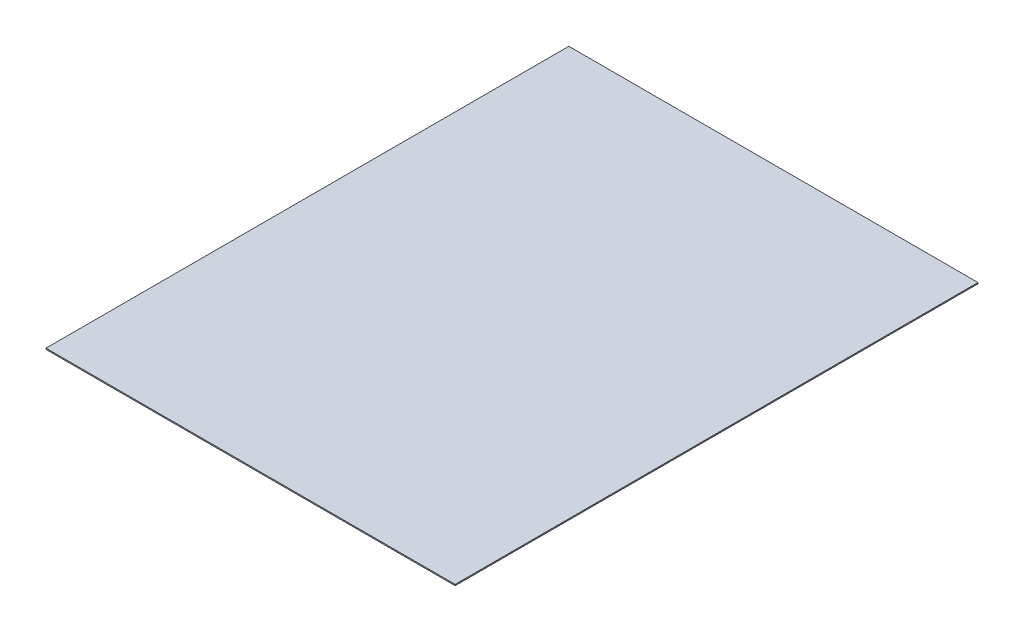
ISO-10303-21;
HEADER;
FILE_DESCRIPTION(('STEP AP214'),'2;1');
FILE_NAME('part.step','',(''),(''),'','','');
FILE_SCHEMA(('AUTOMOTIVE_DESIGN { 1 0 10303 214 1 1 1 1 }'));
ENDSEC;
DATA;
#1=APPLICATION_CONTEXT('core data for automotive mechanical design processes');
#2=APPLICATION_PROTOCOL_DEFINITION('international standard','automotive_design',2000,#1);
#3=PRODUCT_CONTEXT('',#1,'mechanical');
#4=PRODUCT('Part','Part','',(#3));
#5=PRODUCT_RELATED_PRODUCT_CATEGORY('part','',(#4));
#6=PRODUCT_DEFINITION_FORMATION('','',#4);
#7=PRODUCT_DEFINITION_CONTEXT('part definition',#1,'design');
#8=PRODUCT_DEFINITION('design','',#6,#7);
#9=PRODUCT_DEFINITION_SHAPE('','',#8);
#10=(LENGTH_UNIT() NAMED_UNIT(*) SI_UNIT(.MILLI.,.METRE.));
#11=(NAMED_UNIT(*) PLANE_ANGLE_UNIT() SI_UNIT($,.RADIAN.));
#12=(NAMED_UNIT(*) SI_UNIT($,.STERADIAN.) SOLID_ANGLE_UNIT());
#13=UNCERTAINTY_MEASURE_WITH_UNIT(LENGTH_MEASURE(1.E-05),#10,'distance_accuracy_value','');
#14=(GEOMETRIC_REPRESENTATION_CONTEXT(3) GLOBAL_UNCERTAINTY_ASSIGNED_CONTEXT((#13)) GLOBAL_UNIT_ASSIGNED_CONTEXT((#10,
#11,#12)) REPRESENTATION_CONTEXT('',''));
#15=CARTESIAN_POINT('',(0.,0.,0.));
#16=DIRECTION('',(0.,0.,1.));
#17=DIRECTION('',(1.,0.,0.));
#18=AXIS2_PLACEMENT_3D('',#15,#16,#17);
#19=CARTESIAN_POINT('',(-180.,0.,230.));
#20=DIRECTION('',(1.,0.,0.));
#21=DIRECTION('',(0.,0.,1.));
#22=AXIS2_PLACEMENT_3D('',#19,#20,#21);
#23=PLANE('',#22);
#24=DIRECTION('',(0.,1.,0.));
#25=VECTOR('',#24,1.);
#26=CARTESIAN_POINT('',(-180.,0.,-230.));
#27=LINE('',#26,#25);
#28=CARTESIAN_POINT('',(-180.,0.,-230.));
#29=VERTEX_POINT('',#28);
#30=CARTESIAN_POINT('',(-180.,1.,-230.));
#31=VERTEX_POINT('',#30);
#32=EDGE_CURVE('E11',#29,#31,#27,.T.);
#33=ORIENTED_EDGE('',*,*,#32,.F.);
#34=DIRECTION('',(0.,0.,1.));
#35=VECTOR('',#34,1.);
#36=CARTESIAN_POINT('',(-180.,0.,230.));
#37=LINE('',#36,#35);
#38=CARTESIAN_POINT('',(-180.,0.,230.));
#39=VERTEX_POINT('',#38);
#40=EDGE_CURVE('E90',#29,#39,#37,.T.);
#41=ORIENTED_EDGE('',*,*,#40,.T.);
#42=DIRECTION('',(0.,1.,0.));
#43=VECTOR('',#42,1.);
#44=CARTESIAN_POINT('',(-180.,0.,230.));
#45=LINE('',#44,#43);
#46=CARTESIAN_POINT('',(-180.,1.,230.));
#47=VERTEX_POINT('',#46);
#48=EDGE_CURVE('E45',#39,#47,#45,.T.);
#49=ORIENTED_EDGE('',*,*,#48,.T.);
#50=DIRECTION('',(0.,0.,-1.));
#51=VECTOR('',#50,1.);
#52=CARTESIAN_POINT('',(-180.,1.,0.));
#53=LINE('',#52,#51);
#54=EDGE_CURVE('E100',#31,#47,#53,.F.);
#55=ORIENTED_EDGE('',*,*,#54,.F.);
#56=EDGE_LOOP('',(#33,#41,#49,#55));
#57=FACE_BOUND('',#56,.T.);
#58=ADVANCED_FACE('F35',(#57),#23,.F.);
#59=CARTESIAN_POINT('',(-180.,0.,230.));
#60=DIRECTION('',(0.,0.,-1.));
#61=DIRECTION('',(1.,0.,0.));
#62=AXIS2_PLACEMENT_3D('',#59,#60,#61);
#63=PLANE('',#62);
#64=ORIENTED_EDGE('',*,*,#48,.F.);
#65=DIRECTION('',(1.,0.,0.));
#66=VECTOR('',#65,1.);
#67=CARTESIAN_POINT('',(-180.,0.,230.));
#68=LINE('',#67,#66);
#69=CARTESIAN_POINT('',(180.,0.,230.));
#70=VERTEX_POINT('',#69);
#71=EDGE_CURVE('E85',#39,#70,#68,.T.);
#72=ORIENTED_EDGE('',*,*,#71,.T.);
#73=DIRECTION('',(0.,1.,0.));
#74=VECTOR('',#73,1.);
#75=CARTESIAN_POINT('',(180.,0.,230.));
#76=LINE('',#75,#74);
#77=CARTESIAN_POINT('',(180.,1.,230.));
#78=VERTEX_POINT('',#77);
#79=EDGE_CURVE('E53',#70,#78,#76,.T.);
#80=ORIENTED_EDGE('',*,*,#79,.T.);
#81=DIRECTION('',(1.,0.,0.));
#82=VECTOR('',#81,1.);
#83=CARTESIAN_POINT('',(0.,1.,230.));
#84=LINE('',#83,#82);
#85=EDGE_CURVE('E104',#47,#78,#84,.T.);
#86=ORIENTED_EDGE('',*,*,#85,.F.);
#87=EDGE_LOOP('',(#64,#72,#80,#86));
#88=FACE_BOUND('',#87,.T.);
#89=ADVANCED_FACE('F89',(#88),#63,.F.);
#90=CARTESIAN_POINT('',(180.,0.,230.));
#91=DIRECTION('',(-1.,0.,0.));
#92=DIRECTION('',(0.,0.,-1.));
#93=AXIS2_PLACEMENT_3D('',#90,#91,#92);
#94=PLANE('',#93);
#95=ORIENTED_EDGE('',*,*,#79,.F.);
#96=DIRECTION('',(0.,0.,-1.));
#97=VECTOR('',#96,1.);
#98=CARTESIAN_POINT('',(180.,0.,230.));
#99=LINE('',#98,#97);
#100=CARTESIAN_POINT('',(180.,0.,-230.));
#101=VERTEX_POINT('',#100);
#102=EDGE_CURVE('E75',#70,#101,#99,.T.);
#103=ORIENTED_EDGE('',*,*,#102,.T.);
#104=DIRECTION('',(0.,1.,0.));
#105=VECTOR('',#104,1.);
#106=CARTESIAN_POINT('',(180.,0.,-230.));
#107=LINE('',#106,#105);
#108=CARTESIAN_POINT('',(180.,1.,-230.));
#109=VERTEX_POINT('',#108);
#110=EDGE_CURVE('E39',#101,#109,#107,.T.);
#111=ORIENTED_EDGE('',*,*,#110,.T.);
#112=DIRECTION('',(0.,0.,-1.));
#113=VECTOR('',#112,1.);
#114=CARTESIAN_POINT('',(180.,1.,0.));
#115=LINE('',#114,#113);
#116=EDGE_CURVE('E77',#78,#109,#115,.T.);
#117=ORIENTED_EDGE('',*,*,#116,.F.);
#118=EDGE_LOOP('',(#95,#103,#111,#117));
#119=FACE_BOUND('',#118,.T.);
#120=ADVANCED_FACE('F74',(#119),#94,.F.);
#121=CARTESIAN_POINT('',(-180.,0.,-230.));
#122=DIRECTION('',(0.,0.,1.));
#123=DIRECTION('',(-1.,0.,0.));
#124=AXIS2_PLACEMENT_3D('',#121,#122,#123);
#125=PLANE('',#124);
#126=DIRECTION('',(-1.,0.,0.));
#127=VECTOR('',#126,1.);
#128=CARTESIAN_POINT('',(-180.,0.,-230.));
#129=LINE('',#128,#127);
#130=EDGE_CURVE('E87',#101,#29,#129,.T.);
#131=ORIENTED_EDGE('',*,*,#130,.T.);
#132=ORIENTED_EDGE('',*,*,#32,.T.);
#133=DIRECTION('',(1.,0.,0.));
#134=VECTOR('',#133,1.);
#135=CARTESIAN_POINT('',(0.,1.,-230.));
#136=LINE('',#135,#134);
#137=EDGE_CURVE('E92',#109,#31,#136,.F.);
#138=ORIENTED_EDGE('',*,*,#137,.F.);
#139=ORIENTED_EDGE('',*,*,#110,.F.);
#140=EDGE_LOOP('',(#131,#132,#138,#139));
#141=FACE_BOUND('',#140,.T.);
#142=ADVANCED_FACE('F37',(#141),#125,.F.);
#143=CARTESIAN_POINT('',(0.,1.,0.));
#144=DIRECTION('',(0.,-1.,0.));
#145=DIRECTION('',(0.,0.,-1.));
#146=AXIS2_PLACEMENT_3D('',#143,#144,#145);
#147=PLANE('',#146);
#148=ORIENTED_EDGE('',*,*,#116,.T.);
#149=ORIENTED_EDGE('',*,*,#137,.T.);
#150=ORIENTED_EDGE('',*,*,#54,.T.);
#151=ORIENTED_EDGE('',*,*,#85,.T.);
#152=EDGE_LOOP('',(#148,#149,#150,#151));
#153=FACE_BOUND('',#152,.T.);
#154=ADVANCED_FACE('F103',(#153),#147,.F.);
#155=CARTESIAN_POINT('',(0.,0.,0.));
#156=DIRECTION('',(0.,-1.,0.));
#157=DIRECTION('',(0.,0.,-1.));
#158=AXIS2_PLACEMENT_3D('',#155,#156,#157);
#159=PLANE('',#158);
#160=ORIENTED_EDGE('',*,*,#102,.F.);
#161=ORIENTED_EDGE('',*,*,#71,.F.);
#162=ORIENTED_EDGE('',*,*,#40,.F.);
#163=ORIENTED_EDGE('',*,*,#130,.F.);
#164=EDGE_LOOP('',(#160,#161,#162,#163));
#165=FACE_BOUND('',#164,.T.);
#166=ADVANCED_FACE('F83',(#165),#159,.T.);
#167=CLOSED_SHELL('',(#58,#89,#120,#142,#154,#166));
#168=MANIFOLD_SOLID_BREP('B2',#167);
#169=ADVANCED_BREP_SHAPE_REPRESENTATION('',(#18,#168),#14);
#170=SHAPE_DEFINITION_REPRESENTATION(#9,#169);
ENDSEC;
END-ISO-10303-21;
